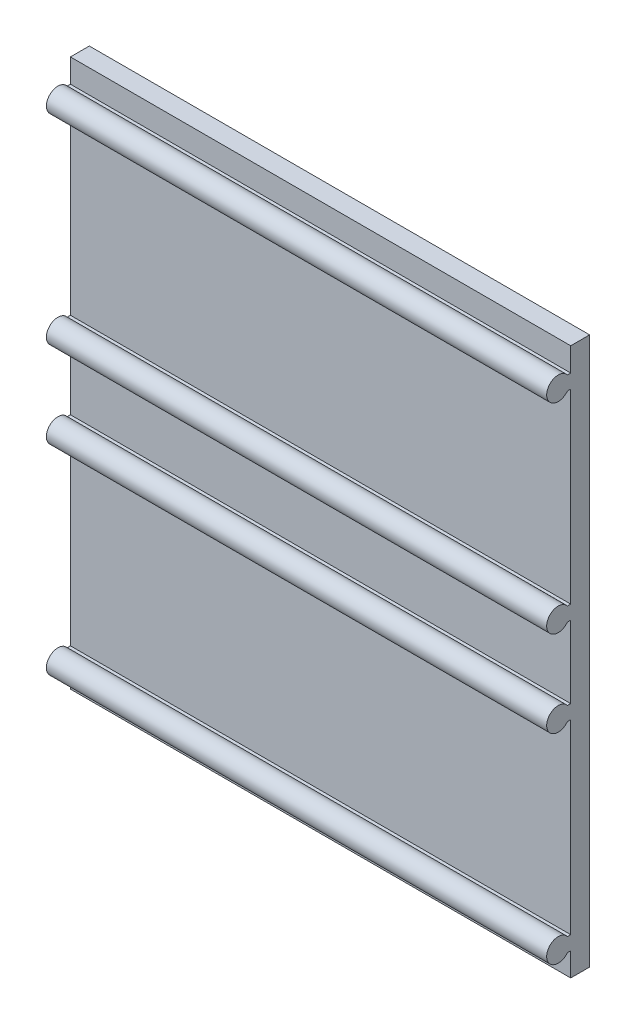
ISO-10303-21;
HEADER;
FILE_DESCRIPTION(('STEP AP214'),'2;1');
FILE_NAME('part.step','',(''),(''),'','','');
FILE_SCHEMA(('AUTOMOTIVE_DESIGN { 1 0 10303 214 1 1 1 1 }'));
ENDSEC;
DATA;
#1=APPLICATION_CONTEXT('core data for automotive mechanical design processes');
#2=APPLICATION_PROTOCOL_DEFINITION('international standard','automotive_design',2000,#1);
#3=PRODUCT_CONTEXT('',#1,'mechanical');
#4=PRODUCT('Part','Part','',(#3));
#5=PRODUCT_RELATED_PRODUCT_CATEGORY('part','',(#4));
#6=PRODUCT_DEFINITION_FORMATION('','',#4);
#7=PRODUCT_DEFINITION_CONTEXT('part definition',#1,'design');
#8=PRODUCT_DEFINITION('design','',#6,#7);
#9=PRODUCT_DEFINITION_SHAPE('','',#8);
#10=(LENGTH_UNIT() NAMED_UNIT(*) SI_UNIT(.MILLI.,.METRE.));
#11=(NAMED_UNIT(*) PLANE_ANGLE_UNIT() SI_UNIT($,.RADIAN.));
#12=(NAMED_UNIT(*) SI_UNIT($,.STERADIAN.) SOLID_ANGLE_UNIT());
#13=UNCERTAINTY_MEASURE_WITH_UNIT(LENGTH_MEASURE(1.E-05),#10,'distance_accuracy_value','');
#14=(GEOMETRIC_REPRESENTATION_CONTEXT(3) GLOBAL_UNCERTAINTY_ASSIGNED_CONTEXT((#13)) GLOBAL_UNIT_ASSIGNED_CONTEXT((#10,
#11,#12)) REPRESENTATION_CONTEXT('',''));
#15=CARTESIAN_POINT('',(0.,0.,0.));
#16=DIRECTION('',(0.,0.,1.));
#17=DIRECTION('',(1.,0.,0.));
#18=AXIS2_PLACEMENT_3D('',#15,#16,#17);
#19=CARTESIAN_POINT('',(90.,224.250000000007,-5.50000000000004));
#20=DIRECTION('',(1.,0.,0.));
#21=DIRECTION('',(0.,0.,-1.));
#22=AXIS2_PLACEMENT_3D('',#19,#20,#21);
#23=PLANE('',#22);
#24=DIRECTION('',(0.,0.,-1.));
#25=VECTOR('',#24,1.);
#26=CARTESIAN_POINT('',(90.,226.500000000007,37.4999999999997));
#27=LINE('',#26,#25);
#28=CARTESIAN_POINT('',(90.,226.500000000007,37.4999999999997));
#29=VERTEX_POINT('',#28);
#30=CARTESIAN_POINT('',(90.,226.500000000007,34.0999999999997));
#31=VERTEX_POINT('',#30);
#32=EDGE_CURVE('E213',#29,#31,#27,.T.);
#33=ORIENTED_EDGE('',*,*,#32,.T.);
#34=DIRECTION('',(0.,-1.,0.));
#35=VECTOR('',#34,1.);
#36=CARTESIAN_POINT('',(90.,325.,34.0999999999997));
#37=LINE('',#36,#35);
#38=CARTESIAN_POINT('',(90.,325.,34.0999999999997));
#39=VERTEX_POINT('',#38);
#40=EDGE_CURVE('E194',#39,#31,#37,.T.);
#41=ORIENTED_EDGE('',*,*,#40,.F.);
#42=DIRECTION('',(0.,0.,1.));
#43=VECTOR('',#42,1.);
#44=CARTESIAN_POINT('',(90.,325.,35.2499999999997));
#45=LINE('',#44,#43);
#46=CARTESIAN_POINT('',(90.,325.,37.4999999999997));
#47=VERTEX_POINT('',#46);
#48=EDGE_CURVE('E199',#39,#47,#45,.T.);
#49=ORIENTED_EDGE('',*,*,#48,.T.);
#50=DIRECTION('',(0.,-1.,0.));
#51=VECTOR('',#50,1.);
#52=CARTESIAN_POINT('',(90.,328.950000000006,37.4999999999878));
#53=LINE('',#52,#51);
#54=CARTESIAN_POINT('',(90.,320.750000000001,37.4999999999875));
#55=VERTEX_POINT('',#54);
#56=EDGE_CURVE('E58',#47,#55,#53,.T.);
#57=ORIENTED_EDGE('',*,*,#56,.T.);
#58=DIRECTION('',(0.,0.,1.));
#59=VECTOR('',#58,1.);
#60=CARTESIAN_POINT('',(90.,320.750000000001,-6.75000000000008));
#61=LINE('',#60,#59);
#62=CARTESIAN_POINT('',(90.,320.750000000001,38.0937617924896));
#63=VERTEX_POINT('',#62);
#64=EDGE_CURVE('E209',#55,#63,#61,.T.);
#65=ORIENTED_EDGE('',*,*,#64,.T.);
#66=CARTESIAN_POINT('',(90.,319.500000000007,39.7499999999997));
#67=DIRECTION('',(1.,0.,0.));
#68=DIRECTION('',(0.,0.,-1.));
#69=AXIS2_PLACEMENT_3D('',#66,#67,#68);
#70=CIRCLE('',#69,2.075);
#71=CARTESIAN_POINT('',(90.,318.250000000001,38.0937617924991));
#72=VERTEX_POINT('',#71);
#73=EDGE_CURVE('E257',#63,#72,#70,.T.);
#74=ORIENTED_EDGE('',*,*,#73,.T.);
#75=DIRECTION('',(0.,0.,-1.));
#76=VECTOR('',#75,1.);
#77=CARTESIAN_POINT('',(90.,318.250000000001,38.0937617924991));
#78=LINE('',#77,#76);
#79=CARTESIAN_POINT('',(90.,318.250000000001,37.4999999999997));
#80=VERTEX_POINT('',#79);
#81=EDGE_CURVE('E260',#72,#80,#78,.T.);
#82=ORIENTED_EDGE('',*,*,#81,.T.);
#83=DIRECTION('',(0.,-1.,0.));
#84=VECTOR('',#83,1.);
#85=CARTESIAN_POINT('',(90.,318.250000000001,37.4999999999997));
#86=LINE('',#85,#84);
#87=CARTESIAN_POINT('',(90.,284.750000000007,37.4999999999997));
#88=VERTEX_POINT('',#87);
#89=EDGE_CURVE('E263',#80,#88,#86,.T.);
#90=ORIENTED_EDGE('',*,*,#89,.T.);
#91=DIRECTION('',(0.,0.,1.));
#92=VECTOR('',#91,1.);
#93=CARTESIAN_POINT('',(90.,284.750000000007,37.4999999999997));
#94=LINE('',#93,#92);
#95=CARTESIAN_POINT('',(90.,284.750000000007,38.0937617924993));
#96=VERTEX_POINT('',#95);
#97=EDGE_CURVE('E266',#88,#96,#94,.T.);
#98=ORIENTED_EDGE('',*,*,#97,.T.);
#99=CARTESIAN_POINT('',(90.,283.500000000001,39.7499999999994));
#100=DIRECTION('',(1.,0.,0.));
#101=DIRECTION('',(0.,0.,-1.));
#102=AXIS2_PLACEMENT_3D('',#99,#100,#101);
#103=CIRCLE('',#102,2.07499999999945);
#104=CARTESIAN_POINT('',(90.,282.250000000007,38.0937617924901));
#105=VERTEX_POINT('',#104);
#106=EDGE_CURVE('E269',#96,#105,#103,.T.);
#107=ORIENTED_EDGE('',*,*,#106,.T.);
#108=DIRECTION('',(0.,5.60943650467305E-13,-1.));
#109=VECTOR('',#108,1.);
#110=CARTESIAN_POINT('',(90.,282.250000000007,38.0937617924901));
#111=LINE('',#110,#109);
#112=CARTESIAN_POINT('',(90.,282.250000000008,37.4999999999997));
#113=VERTEX_POINT('',#112);
#114=EDGE_CURVE('E272',#105,#113,#111,.T.);
#115=ORIENTED_EDGE('',*,*,#114,.T.);
#116=DIRECTION('',(0.,-1.,0.));
#117=VECTOR('',#116,1.);
#118=CARTESIAN_POINT('',(90.,282.250000000008,37.4999999999997));
#119=LINE('',#118,#117);
#120=CARTESIAN_POINT('',(90.,269.25,37.4999999999997));
#121=VERTEX_POINT('',#120);
#122=EDGE_CURVE('E275',#113,#121,#119,.T.);
#123=ORIENTED_EDGE('',*,*,#122,.T.);
#124=DIRECTION('',(0.,1.21537790934668E-12,1.));
#125=VECTOR('',#124,1.);
#126=CARTESIAN_POINT('',(90.,269.25,37.4999999999997));
#127=LINE('',#126,#125);
#128=CARTESIAN_POINT('',(90.,269.250000000001,38.0937617924896));
#129=VERTEX_POINT('',#128);
#130=EDGE_CURVE('E278',#121,#129,#127,.T.);
#131=ORIENTED_EDGE('',*,*,#130,.T.);
#132=CARTESIAN_POINT('',(90.,268.000000000007,39.7499999999997));
#133=DIRECTION('',(1.,0.,0.));
#134=DIRECTION('',(0.,0.,-1.));
#135=AXIS2_PLACEMENT_3D('',#132,#133,#134);
#136=CIRCLE('',#135,2.075);
#137=CARTESIAN_POINT('',(90.,266.750000000001,38.0937617924991));
#138=VERTEX_POINT('',#137);
#139=EDGE_CURVE('E281',#129,#138,#136,.T.);
#140=ORIENTED_EDGE('',*,*,#139,.T.);
#141=DIRECTION('',(0.,0.,-1.));
#142=VECTOR('',#141,1.);
#143=CARTESIAN_POINT('',(90.,266.750000000001,38.0937617924991));
#144=LINE('',#143,#142);
#145=CARTESIAN_POINT('',(90.,266.750000000001,37.4999999999997));
#146=VERTEX_POINT('',#145);
#147=EDGE_CURVE('E284',#138,#146,#144,.T.);
#148=ORIENTED_EDGE('',*,*,#147,.T.);
#149=DIRECTION('',(0.,-1.,0.));
#150=VECTOR('',#149,1.);
#151=CARTESIAN_POINT('',(90.,266.750000000001,37.4999999999997));
#152=LINE('',#151,#150);
#153=CARTESIAN_POINT('',(90.,233.250000000007,37.4999999999997));
#154=VERTEX_POINT('',#153);
#155=EDGE_CURVE('E287',#146,#154,#152,.T.);
#156=ORIENTED_EDGE('',*,*,#155,.T.);
#157=DIRECTION('',(0.,0.,1.));
#158=VECTOR('',#157,1.);
#159=CARTESIAN_POINT('',(90.,233.250000000007,37.4999999999997));
#160=LINE('',#159,#158);
#161=CARTESIAN_POINT('',(90.,233.250000000007,38.0937617924993));
#162=VERTEX_POINT('',#161);
#163=EDGE_CURVE('E290',#154,#162,#160,.T.);
#164=ORIENTED_EDGE('',*,*,#163,.T.);
#165=CARTESIAN_POINT('',(90.,232.000000000001,39.7499999999994));
#166=DIRECTION('',(1.,0.,0.));
#167=DIRECTION('',(0.,0.,-1.));
#168=AXIS2_PLACEMENT_3D('',#165,#166,#167);
#169=CIRCLE('',#168,2.07499999999947);
#170=CARTESIAN_POINT('',(90.,230.750000000007,38.0937617924903));
#171=VERTEX_POINT('',#170);
#172=EDGE_CURVE('E293',#162,#171,#169,.T.);
#173=ORIENTED_EDGE('',*,*,#172,.T.);
#174=DIRECTION('',(0.,0.,-1.));
#175=VECTOR('',#174,1.);
#176=CARTESIAN_POINT('',(90.,230.750000000007,38.0937617924903));
#177=LINE('',#176,#175);
#178=CARTESIAN_POINT('',(90.,230.750000000007,37.4999999999997));
#179=VERTEX_POINT('',#178);
#180=EDGE_CURVE('E296',#171,#179,#177,.T.);
#181=ORIENTED_EDGE('',*,*,#180,.T.);
#182=DIRECTION('',(0.,-1.,0.));
#183=VECTOR('',#182,1.);
#184=CARTESIAN_POINT('',(90.,230.750000000007,37.4999999999997));
#185=LINE('',#184,#183);
#186=EDGE_CURVE('E299',#179,#29,#185,.T.);
#187=ORIENTED_EDGE('',*,*,#186,.T.);
#188=EDGE_LOOP('',(#33,#41,#49,#57,#65,#74,#82,#90,#98,#107,#115,#123,#131,#140,#148,#156,#164,
#173,#181,#187));
#189=FACE_BOUND('',#188,.T.);
#190=ADVANCED_FACE('F33',(#189),#23,.T.);
#191=CARTESIAN_POINT('',(0.,224.250000000007,-5.50000000000004));
#192=DIRECTION('',(1.,0.,0.));
#193=DIRECTION('',(0.,0.,-1.));
#194=AXIS2_PLACEMENT_3D('',#191,#192,#193);
#195=PLANE('',#194);
#196=DIRECTION('',(0.,0.,1.));
#197=VECTOR('',#196,1.);
#198=CARTESIAN_POINT('',(0.,325.,35.2499999999997));
#199=LINE('',#198,#197);
#200=CARTESIAN_POINT('',(0.,325.,34.0999999999997));
#201=VERTEX_POINT('',#200);
#202=CARTESIAN_POINT('',(0.,325.,37.4999999999876));
#203=VERTEX_POINT('',#202);
#204=EDGE_CURVE('E50',#201,#203,#199,.T.);
#205=ORIENTED_EDGE('',*,*,#204,.F.);
#206=DIRECTION('',(0.,1.,0.));
#207=VECTOR('',#206,1.);
#208=CARTESIAN_POINT('',(0.,226.500000000007,34.0999999999997));
#209=LINE('',#208,#207);
#210=CARTESIAN_POINT('',(0.,226.500000000007,34.0999999999997));
#211=VERTEX_POINT('',#210);
#212=EDGE_CURVE('E184',#211,#201,#209,.T.);
#213=ORIENTED_EDGE('',*,*,#212,.F.);
#214=DIRECTION('',(0.,0.,-1.));
#215=VECTOR('',#214,1.);
#216=CARTESIAN_POINT('',(0.,226.500000000007,37.4999999999997));
#217=LINE('',#216,#215);
#218=CARTESIAN_POINT('',(0.,226.500000000007,37.4999999999997));
#219=VERTEX_POINT('',#218);
#220=EDGE_CURVE('E172',#219,#211,#217,.T.);
#221=ORIENTED_EDGE('',*,*,#220,.F.);
#222=DIRECTION('',(0.,-1.,0.));
#223=VECTOR('',#222,1.);
#224=CARTESIAN_POINT('',(0.,230.750000000007,37.4999999999997));
#225=LINE('',#224,#223);
#226=CARTESIAN_POINT('',(0.,230.750000000007,37.4999999999997));
#227=VERTEX_POINT('',#226);
#228=EDGE_CURVE('E181',#227,#219,#225,.T.);
#229=ORIENTED_EDGE('',*,*,#228,.F.);
#230=DIRECTION('',(0.,0.,-1.));
#231=VECTOR('',#230,1.);
#232=CARTESIAN_POINT('',(0.,230.750000000007,38.0937617924903));
#233=LINE('',#232,#231);
#234=CARTESIAN_POINT('',(0.,230.750000000007,38.0937617924903));
#235=VERTEX_POINT('',#234);
#236=EDGE_CURVE('E252',#235,#227,#233,.T.);
#237=ORIENTED_EDGE('',*,*,#236,.F.);
#238=CARTESIAN_POINT('',(0.,232.000000000001,39.7499999999994));
#239=DIRECTION('',(1.,0.,0.));
#240=DIRECTION('',(0.,0.,-1.));
#241=AXIS2_PLACEMENT_3D('',#238,#239,#240);
#242=CIRCLE('',#241,2.07499999999947);
#243=CARTESIAN_POINT('',(0.,233.250000000007,38.0937617924993));
#244=VERTEX_POINT('',#243);
#245=EDGE_CURVE('E249',#244,#235,#242,.T.);
#246=ORIENTED_EDGE('',*,*,#245,.F.);
#247=DIRECTION('',(0.,0.,1.));
#248=VECTOR('',#247,1.);
#249=CARTESIAN_POINT('',(0.,233.250000000007,37.4999999999997));
#250=LINE('',#249,#248);
#251=CARTESIAN_POINT('',(0.,233.250000000007,37.4999999999997));
#252=VERTEX_POINT('',#251);
#253=EDGE_CURVE('E246',#252,#244,#250,.T.);
#254=ORIENTED_EDGE('',*,*,#253,.F.);
#255=DIRECTION('',(0.,-1.,0.));
#256=VECTOR('',#255,1.);
#257=CARTESIAN_POINT('',(0.,266.750000000001,37.4999999999997));
#258=LINE('',#257,#256);
#259=CARTESIAN_POINT('',(0.,266.750000000001,37.4999999999997));
#260=VERTEX_POINT('',#259);
#261=EDGE_CURVE('E243',#260,#252,#258,.T.);
#262=ORIENTED_EDGE('',*,*,#261,.F.);
#263=DIRECTION('',(0.,0.,-1.));
#264=VECTOR('',#263,1.);
#265=CARTESIAN_POINT('',(0.,266.750000000001,38.0937617924991));
#266=LINE('',#265,#264);
#267=CARTESIAN_POINT('',(0.,266.750000000001,38.0937617924991));
#268=VERTEX_POINT('',#267);
#269=EDGE_CURVE('E240',#268,#260,#266,.T.);
#270=ORIENTED_EDGE('',*,*,#269,.F.);
#271=CARTESIAN_POINT('',(0.,268.000000000007,39.7499999999997));
#272=DIRECTION('',(1.,0.,0.));
#273=DIRECTION('',(0.,0.,-1.));
#274=AXIS2_PLACEMENT_3D('',#271,#272,#273);
#275=CIRCLE('',#274,2.075);
#276=CARTESIAN_POINT('',(0.,269.250000000001,38.0937617924896));
#277=VERTEX_POINT('',#276);
#278=EDGE_CURVE('E237',#277,#268,#275,.T.);
#279=ORIENTED_EDGE('',*,*,#278,.F.);
#280=DIRECTION('',(0.,1.21537790934668E-12,1.));
#281=VECTOR('',#280,1.);
#282=CARTESIAN_POINT('',(0.,269.25,37.4999999999997));
#283=LINE('',#282,#281);
#284=CARTESIAN_POINT('',(0.,269.25,37.4999999999997));
#285=VERTEX_POINT('',#284);
#286=EDGE_CURVE('E234',#285,#277,#283,.T.);
#287=ORIENTED_EDGE('',*,*,#286,.F.);
#288=DIRECTION('',(0.,-1.,0.));
#289=VECTOR('',#288,1.);
#290=CARTESIAN_POINT('',(0.,282.250000000008,37.4999999999997));
#291=LINE('',#290,#289);
#292=CARTESIAN_POINT('',(0.,282.250000000008,37.4999999999997));
#293=VERTEX_POINT('',#292);
#294=EDGE_CURVE('E231',#293,#285,#291,.T.);
#295=ORIENTED_EDGE('',*,*,#294,.F.);
#296=DIRECTION('',(0.,5.60943650467305E-13,-1.));
#297=VECTOR('',#296,1.);
#298=CARTESIAN_POINT('',(0.,282.250000000007,38.0937617924901));
#299=LINE('',#298,#297);
#300=CARTESIAN_POINT('',(0.,282.250000000007,38.0937617924901));
#301=VERTEX_POINT('',#300);
#302=EDGE_CURVE('E228',#301,#293,#299,.T.);
#303=ORIENTED_EDGE('',*,*,#302,.F.);
#304=CARTESIAN_POINT('',(0.,283.500000000001,39.7499999999994));
#305=DIRECTION('',(1.,0.,0.));
#306=DIRECTION('',(0.,0.,-1.));
#307=AXIS2_PLACEMENT_3D('',#304,#305,#306);
#308=CIRCLE('',#307,2.07499999999945);
#309=CARTESIAN_POINT('',(0.,284.750000000007,38.0937617924993));
#310=VERTEX_POINT('',#309);
#311=EDGE_CURVE('E225',#310,#301,#308,.T.);
#312=ORIENTED_EDGE('',*,*,#311,.F.);
#313=DIRECTION('',(0.,0.,1.));
#314=VECTOR('',#313,1.);
#315=CARTESIAN_POINT('',(0.,284.750000000007,37.4999999999997));
#316=LINE('',#315,#314);
#317=CARTESIAN_POINT('',(0.,284.750000000007,37.4999999999997));
#318=VERTEX_POINT('',#317);
#319=EDGE_CURVE('E222',#318,#310,#316,.T.);
#320=ORIENTED_EDGE('',*,*,#319,.F.);
#321=DIRECTION('',(0.,-1.,0.));
#322=VECTOR('',#321,1.);
#323=CARTESIAN_POINT('',(0.,318.250000000001,37.4999999999997));
#324=LINE('',#323,#322);
#325=CARTESIAN_POINT('',(0.,318.250000000001,37.4999999999997));
#326=VERTEX_POINT('',#325);
#327=EDGE_CURVE('E219',#326,#318,#324,.T.);
#328=ORIENTED_EDGE('',*,*,#327,.F.);
#329=DIRECTION('',(0.,0.,-1.));
#330=VECTOR('',#329,1.);
#331=CARTESIAN_POINT('',(0.,318.250000000001,38.0937617924991));
#332=LINE('',#331,#330);
#333=CARTESIAN_POINT('',(0.,318.250000000001,38.0937617924991));
#334=VERTEX_POINT('',#333);
#335=EDGE_CURVE('E216',#334,#326,#332,.T.);
#336=ORIENTED_EDGE('',*,*,#335,.F.);
#337=CARTESIAN_POINT('',(0.,319.500000000007,39.7499999999997));
#338=DIRECTION('',(1.,0.,0.));
#339=DIRECTION('',(0.,0.,-1.));
#340=AXIS2_PLACEMENT_3D('',#337,#338,#339);
#341=CIRCLE('',#340,2.075);
#342=CARTESIAN_POINT('',(0.,320.750000000001,38.0937617924896));
#343=VERTEX_POINT('',#342);
#344=EDGE_CURVE('E212',#343,#334,#341,.T.);
#345=ORIENTED_EDGE('',*,*,#344,.F.);
#346=DIRECTION('',(0.,0.,1.));
#347=VECTOR('',#346,1.);
#348=CARTESIAN_POINT('',(0.,320.750000000001,-6.75000000000008));
#349=LINE('',#348,#347);
#350=CARTESIAN_POINT('',(0.,320.749999999999,37.4999999999875));
#351=VERTEX_POINT('',#350);
#352=EDGE_CURVE('E210',#351,#343,#349,.T.);
#353=ORIENTED_EDGE('',*,*,#352,.F.);
#354=DIRECTION('',(0.,-1.,0.));
#355=VECTOR('',#354,1.);
#356=CARTESIAN_POINT('',(0.,328.950000000006,37.4999999999878));
#357=LINE('',#356,#355);
#358=EDGE_CURVE('E207',#203,#351,#357,.T.);
#359=ORIENTED_EDGE('',*,*,#358,.F.);
#360=EDGE_LOOP('',(#205,#213,#221,#229,#237,#246,#254,#262,#270,#279,#287,#295,#303,#312,#320,
#328,#336,#345,#353,#359));
#361=FACE_BOUND('',#360,.T.);
#362=ADVANCED_FACE('F185',(#361),#195,.F.);
#363=CARTESIAN_POINT('',(0.,320.750000000001,-6.75000000000008));
#364=DIRECTION('',(0.,1.,0.));
#365=DIRECTION('',(0.,0.,1.));
#366=AXIS2_PLACEMENT_3D('',#363,#364,#365);
#367=PLANE('',#366);
#368=ORIENTED_EDGE('',*,*,#64,.F.);
#369=DIRECTION('',(1.,0.,0.));
#370=VECTOR('',#369,1.);
#371=CARTESIAN_POINT('',(90.,320.749999999999,37.4999999999875));
#372=LINE('',#371,#370);
#373=EDGE_CURVE('E204',#351,#55,#372,.T.);
#374=ORIENTED_EDGE('',*,*,#373,.F.);
#375=ORIENTED_EDGE('',*,*,#352,.T.);
#376=DIRECTION('',(1.,0.,0.));
#377=VECTOR('',#376,1.);
#378=CARTESIAN_POINT('',(0.,320.750000000001,38.0937617924896));
#379=LINE('',#378,#377);
#380=EDGE_CURVE('E37',#343,#63,#379,.T.);
#381=ORIENTED_EDGE('',*,*,#380,.T.);
#382=EDGE_LOOP('',(#368,#374,#375,#381));
#383=FACE_BOUND('',#382,.T.);
#384=ADVANCED_FACE('F35',(#383),#367,.T.);
#385=CARTESIAN_POINT('',(0.,226.500000000007,37.4999999999997));
#386=DIRECTION('',(0.,-1.,0.));
#387=DIRECTION('',(0.,0.,-1.));
#388=AXIS2_PLACEMENT_3D('',#385,#386,#387);
#389=PLANE('',#388);
#390=ORIENTED_EDGE('',*,*,#220,.T.);
#391=DIRECTION('',(-1.,0.,0.));
#392=VECTOR('',#391,1.);
#393=CARTESIAN_POINT('',(90.,226.500000000007,34.0999999999997));
#394=LINE('',#393,#392);
#395=EDGE_CURVE('E177',#31,#211,#394,.T.);
#396=ORIENTED_EDGE('',*,*,#395,.F.);
#397=ORIENTED_EDGE('',*,*,#32,.F.);
#398=DIRECTION('',(1.,0.,0.));
#399=VECTOR('',#398,1.);
#400=CARTESIAN_POINT('',(0.,226.500000000007,37.4999999999997));
#401=LINE('',#400,#399);
#402=EDGE_CURVE('E11',#219,#29,#401,.T.);
#403=ORIENTED_EDGE('',*,*,#402,.F.);
#404=EDGE_LOOP('',(#390,#396,#397,#403));
#405=FACE_BOUND('',#404,.T.);
#406=ADVANCED_FACE('F174',(#405),#389,.T.);
#407=CARTESIAN_POINT('',(0.,230.750000000007,37.4999999999997));
#408=DIRECTION('',(0.,0.,1.));
#409=DIRECTION('',(1.,0.,0.));
#410=AXIS2_PLACEMENT_3D('',#407,#408,#409);
#411=PLANE('',#410);
#412=ORIENTED_EDGE('',*,*,#186,.F.);
#413=DIRECTION('',(1.,0.,0.));
#414=VECTOR('',#413,1.);
#415=CARTESIAN_POINT('',(0.,230.750000000007,37.4999999999997));
#416=LINE('',#415,#414);
#417=EDGE_CURVE('E42',#227,#179,#416,.T.);
#418=ORIENTED_EDGE('',*,*,#417,.F.);
#419=ORIENTED_EDGE('',*,*,#228,.T.);
#420=ORIENTED_EDGE('',*,*,#402,.T.);
#421=EDGE_LOOP('',(#412,#418,#419,#420));
#422=FACE_BOUND('',#421,.T.);
#423=ADVANCED_FACE('F392',(#422),#411,.T.);
#424=CARTESIAN_POINT('',(0.,230.750000000007,38.0937617924903));
#425=DIRECTION('',(0.,-1.,0.));
#426=DIRECTION('',(0.,0.,-1.));
#427=AXIS2_PLACEMENT_3D('',#424,#425,#426);
#428=PLANE('',#427);
#429=ORIENTED_EDGE('',*,*,#180,.F.);
#430=DIRECTION('',(1.,0.,0.));
#431=VECTOR('',#430,1.);
#432=CARTESIAN_POINT('',(0.,230.750000000007,38.0937617924903));
#433=LINE('',#432,#431);
#434=EDGE_CURVE('E304',#235,#171,#433,.T.);
#435=ORIENTED_EDGE('',*,*,#434,.F.);
#436=ORIENTED_EDGE('',*,*,#236,.T.);
#437=ORIENTED_EDGE('',*,*,#417,.T.);
#438=EDGE_LOOP('',(#429,#435,#436,#437));
#439=FACE_BOUND('',#438,.T.);
#440=ADVANCED_FACE('F389',(#439),#428,.T.);
#441=CARTESIAN_POINT('',(0.,232.000000000001,39.7499999999994));
#442=DIRECTION('',(1.,0.,0.));
#443=DIRECTION('',(0.,0.,-1.));
#444=AXIS2_PLACEMENT_3D('',#441,#442,#443);
#445=CYLINDRICAL_SURFACE('',#444,2.07499999999947);
#446=ORIENTED_EDGE('',*,*,#172,.F.);
#447=DIRECTION('',(1.,0.,0.));
#448=VECTOR('',#447,1.);
#449=CARTESIAN_POINT('',(0.,233.250000000007,38.0937617924993));
#450=LINE('',#449,#448);
#451=EDGE_CURVE('E306',#244,#162,#450,.T.);
#452=ORIENTED_EDGE('',*,*,#451,.F.);
#453=ORIENTED_EDGE('',*,*,#245,.T.);
#454=ORIENTED_EDGE('',*,*,#434,.T.);
#455=EDGE_LOOP('',(#446,#452,#453,#454));
#456=FACE_BOUND('',#455,.T.);
#457=ADVANCED_FACE('F385',(#456),#445,.T.);
#458=CARTESIAN_POINT('',(0.,233.250000000007,37.4999999999997));
#459=DIRECTION('',(0.,1.,0.));
#460=DIRECTION('',(0.,0.,1.));
#461=AXIS2_PLACEMENT_3D('',#458,#459,#460);
#462=PLANE('',#461);
#463=ORIENTED_EDGE('',*,*,#163,.F.);
#464=DIRECTION('',(1.,0.,0.));
#465=VECTOR('',#464,1.);
#466=CARTESIAN_POINT('',(0.,233.250000000007,37.4999999999997));
#467=LINE('',#466,#465);
#468=EDGE_CURVE('E308',#252,#154,#467,.T.);
#469=ORIENTED_EDGE('',*,*,#468,.F.);
#470=ORIENTED_EDGE('',*,*,#253,.T.);
#471=ORIENTED_EDGE('',*,*,#451,.T.);
#472=EDGE_LOOP('',(#463,#469,#470,#471));
#473=FACE_BOUND('',#472,.T.);
#474=ADVANCED_FACE('F381',(#473),#462,.T.);
#475=CARTESIAN_POINT('',(0.,266.750000000001,37.4999999999997));
#476=DIRECTION('',(0.,0.,1.));
#477=DIRECTION('',(0.,-1.,0.));
#478=AXIS2_PLACEMENT_3D('',#475,#476,#477);
#479=PLANE('',#478);
#480=ORIENTED_EDGE('',*,*,#155,.F.);
#481=DIRECTION('',(1.,0.,0.));
#482=VECTOR('',#481,1.);
#483=CARTESIAN_POINT('',(0.,266.750000000001,37.4999999999997));
#484=LINE('',#483,#482);
#485=EDGE_CURVE('E310',#260,#146,#484,.T.);
#486=ORIENTED_EDGE('',*,*,#485,.F.);
#487=ORIENTED_EDGE('',*,*,#261,.T.);
#488=ORIENTED_EDGE('',*,*,#468,.T.);
#489=EDGE_LOOP('',(#480,#486,#487,#488));
#490=FACE_BOUND('',#489,.T.);
#491=ADVANCED_FACE('F377',(#490),#479,.T.);
#492=CARTESIAN_POINT('',(0.,266.750000000001,38.0937617924991));
#493=DIRECTION('',(0.,-1.,0.));
#494=DIRECTION('',(0.,0.,-1.));
#495=AXIS2_PLACEMENT_3D('',#492,#493,#494);
#496=PLANE('',#495);
#497=ORIENTED_EDGE('',*,*,#147,.F.);
#498=DIRECTION('',(1.,0.,0.));
#499=VECTOR('',#498,1.);
#500=CARTESIAN_POINT('',(0.,266.750000000001,38.0937617924991));
#501=LINE('',#500,#499);
#502=EDGE_CURVE('E312',#268,#138,#501,.T.);
#503=ORIENTED_EDGE('',*,*,#502,.F.);
#504=ORIENTED_EDGE('',*,*,#269,.T.);
#505=ORIENTED_EDGE('',*,*,#485,.T.);
#506=EDGE_LOOP('',(#497,#503,#504,#505));
#507=FACE_BOUND('',#506,.T.);
#508=ADVANCED_FACE('F373',(#507),#496,.T.);
#509=CARTESIAN_POINT('',(0.,268.000000000007,39.7499999999997));
#510=DIRECTION('',(1.,0.,0.));
#511=DIRECTION('',(0.,0.,-1.));
#512=AXIS2_PLACEMENT_3D('',#509,#510,#511);
#513=CYLINDRICAL_SURFACE('',#512,2.075);
#514=ORIENTED_EDGE('',*,*,#139,.F.);
#515=DIRECTION('',(1.,0.,0.));
#516=VECTOR('',#515,1.);
#517=CARTESIAN_POINT('',(0.,269.250000000001,38.0937617924896));
#518=LINE('',#517,#516);
#519=EDGE_CURVE('E314',#277,#129,#518,.T.);
#520=ORIENTED_EDGE('',*,*,#519,.F.);
#521=ORIENTED_EDGE('',*,*,#278,.T.);
#522=ORIENTED_EDGE('',*,*,#502,.T.);
#523=EDGE_LOOP('',(#514,#520,#521,#522));
#524=FACE_BOUND('',#523,.T.);
#525=ADVANCED_FACE('F369',(#524),#513,.T.);
#526=CARTESIAN_POINT('',(0.,269.25,37.4999999999997));
#527=DIRECTION('',(0.,1.,-1.21537790934668E-12));
#528=DIRECTION('',(0.,1.21537790934668E-12,1.));
#529=AXIS2_PLACEMENT_3D('',#526,#527,#528);
#530=PLANE('',#529);
#531=ORIENTED_EDGE('',*,*,#130,.F.);
#532=DIRECTION('',(1.,0.,0.));
#533=VECTOR('',#532,1.);
#534=CARTESIAN_POINT('',(0.,269.25,37.4999999999997));
#535=LINE('',#534,#533);
#536=EDGE_CURVE('E316',#285,#121,#535,.T.);
#537=ORIENTED_EDGE('',*,*,#536,.F.);
#538=ORIENTED_EDGE('',*,*,#286,.T.);
#539=ORIENTED_EDGE('',*,*,#519,.T.);
#540=EDGE_LOOP('',(#531,#537,#538,#539));
#541=FACE_BOUND('',#540,.T.);
#542=ADVANCED_FACE('F365',(#541),#530,.T.);
#543=CARTESIAN_POINT('',(0.,282.250000000008,37.4999999999997));
#544=DIRECTION('',(0.,0.,1.));
#545=DIRECTION('',(0.,-1.,0.));
#546=AXIS2_PLACEMENT_3D('',#543,#544,#545);
#547=PLANE('',#546);
#548=ORIENTED_EDGE('',*,*,#122,.F.);
#549=DIRECTION('',(1.,0.,0.));
#550=VECTOR('',#549,1.);
#551=CARTESIAN_POINT('',(0.,282.250000000008,37.4999999999997));
#552=LINE('',#551,#550);
#553=EDGE_CURVE('E318',#293,#113,#552,.T.);
#554=ORIENTED_EDGE('',*,*,#553,.F.);
#555=ORIENTED_EDGE('',*,*,#294,.T.);
#556=ORIENTED_EDGE('',*,*,#536,.T.);
#557=EDGE_LOOP('',(#548,#554,#555,#556));
#558=FACE_BOUND('',#557,.T.);
#559=ADVANCED_FACE('F361',(#558),#547,.T.);
#560=CARTESIAN_POINT('',(0.,282.250000000007,38.0937617924901));
#561=DIRECTION('',(0.,-1.,-5.60943650467305E-13));
#562=DIRECTION('',(0.,5.60943650467305E-13,-1.));
#563=AXIS2_PLACEMENT_3D('',#560,#561,#562);
#564=PLANE('',#563);
#565=ORIENTED_EDGE('',*,*,#114,.F.);
#566=DIRECTION('',(1.,0.,0.));
#567=VECTOR('',#566,1.);
#568=CARTESIAN_POINT('',(0.,282.250000000007,38.0937617924901));
#569=LINE('',#568,#567);
#570=EDGE_CURVE('E320',#301,#105,#569,.T.);
#571=ORIENTED_EDGE('',*,*,#570,.F.);
#572=ORIENTED_EDGE('',*,*,#302,.T.);
#573=ORIENTED_EDGE('',*,*,#553,.T.);
#574=EDGE_LOOP('',(#565,#571,#572,#573));
#575=FACE_BOUND('',#574,.T.);
#576=ADVANCED_FACE('F357',(#575),#564,.T.);
#577=CARTESIAN_POINT('',(0.,283.500000000001,39.7499999999994));
#578=DIRECTION('',(1.,0.,0.));
#579=DIRECTION('',(0.,0.,-1.));
#580=AXIS2_PLACEMENT_3D('',#577,#578,#579);
#581=CYLINDRICAL_SURFACE('',#580,2.07499999999945);
#582=ORIENTED_EDGE('',*,*,#106,.F.);
#583=DIRECTION('',(1.,0.,0.));
#584=VECTOR('',#583,1.);
#585=CARTESIAN_POINT('',(0.,284.750000000007,38.0937617924993));
#586=LINE('',#585,#584);
#587=EDGE_CURVE('E322',#310,#96,#586,.T.);
#588=ORIENTED_EDGE('',*,*,#587,.F.);
#589=ORIENTED_EDGE('',*,*,#311,.T.);
#590=ORIENTED_EDGE('',*,*,#570,.T.);
#591=EDGE_LOOP('',(#582,#588,#589,#590));
#592=FACE_BOUND('',#591,.T.);
#593=ADVANCED_FACE('F353',(#592),#581,.T.);
#594=CARTESIAN_POINT('',(0.,284.750000000007,37.4999999999997));
#595=DIRECTION('',(0.,1.,0.));
#596=DIRECTION('',(0.,0.,1.));
#597=AXIS2_PLACEMENT_3D('',#594,#595,#596);
#598=PLANE('',#597);
#599=ORIENTED_EDGE('',*,*,#97,.F.);
#600=DIRECTION('',(1.,0.,0.));
#601=VECTOR('',#600,1.);
#602=CARTESIAN_POINT('',(0.,284.750000000007,37.4999999999997));
#603=LINE('',#602,#601);
#604=EDGE_CURVE('E324',#318,#88,#603,.T.);
#605=ORIENTED_EDGE('',*,*,#604,.F.);
#606=ORIENTED_EDGE('',*,*,#319,.T.);
#607=ORIENTED_EDGE('',*,*,#587,.T.);
#608=EDGE_LOOP('',(#599,#605,#606,#607));
#609=FACE_BOUND('',#608,.T.);
#610=ADVANCED_FACE('F349',(#609),#598,.T.);
#611=CARTESIAN_POINT('',(0.,318.250000000001,37.4999999999997));
#612=DIRECTION('',(0.,0.,1.));
#613=DIRECTION('',(0.,-1.,0.));
#614=AXIS2_PLACEMENT_3D('',#611,#612,#613);
#615=PLANE('',#614);
#616=ORIENTED_EDGE('',*,*,#89,.F.);
#617=DIRECTION('',(1.,0.,0.));
#618=VECTOR('',#617,1.);
#619=CARTESIAN_POINT('',(0.,318.250000000001,37.4999999999997));
#620=LINE('',#619,#618);
#621=EDGE_CURVE('E326',#326,#80,#620,.T.);
#622=ORIENTED_EDGE('',*,*,#621,.F.);
#623=ORIENTED_EDGE('',*,*,#327,.T.);
#624=ORIENTED_EDGE('',*,*,#604,.T.);
#625=EDGE_LOOP('',(#616,#622,#623,#624));
#626=FACE_BOUND('',#625,.T.);
#627=ADVANCED_FACE('F345',(#626),#615,.T.);
#628=CARTESIAN_POINT('',(0.,318.250000000001,38.0937617924991));
#629=DIRECTION('',(0.,-1.,0.));
#630=DIRECTION('',(0.,0.,-1.));
#631=AXIS2_PLACEMENT_3D('',#628,#629,#630);
#632=PLANE('',#631);
#633=ORIENTED_EDGE('',*,*,#81,.F.);
#634=DIRECTION('',(1.,0.,0.));
#635=VECTOR('',#634,1.);
#636=CARTESIAN_POINT('',(0.,318.250000000001,38.0937617924991));
#637=LINE('',#636,#635);
#638=EDGE_CURVE('E327',#334,#72,#637,.T.);
#639=ORIENTED_EDGE('',*,*,#638,.F.);
#640=ORIENTED_EDGE('',*,*,#335,.T.);
#641=ORIENTED_EDGE('',*,*,#621,.T.);
#642=EDGE_LOOP('',(#633,#639,#640,#641));
#643=FACE_BOUND('',#642,.T.);
#644=ADVANCED_FACE('F341',(#643),#632,.T.);
#645=CARTESIAN_POINT('',(0.,319.500000000007,39.7499999999997));
#646=DIRECTION('',(1.,0.,0.));
#647=DIRECTION('',(0.,0.,-1.));
#648=AXIS2_PLACEMENT_3D('',#645,#646,#647);
#649=CYLINDRICAL_SURFACE('',#648,2.075);
#650=ORIENTED_EDGE('',*,*,#73,.F.);
#651=ORIENTED_EDGE('',*,*,#380,.F.);
#652=ORIENTED_EDGE('',*,*,#344,.T.);
#653=ORIENTED_EDGE('',*,*,#638,.T.);
#654=EDGE_LOOP('',(#650,#651,#652,#653));
#655=FACE_BOUND('',#654,.T.);
#656=ADVANCED_FACE('F338',(#655),#649,.T.);
#657=CARTESIAN_POINT('',(90.,328.950000000006,37.4999999999878));
#658=DIRECTION('',(0.,0.,-1.));
#659=DIRECTION('',(0.,1.,0.));
#660=AXIS2_PLACEMENT_3D('',#657,#658,#659);
#661=PLANE('',#660);
#662=ORIENTED_EDGE('',*,*,#56,.F.);
#663=DIRECTION('',(-1.,0.,0.));
#664=VECTOR('',#663,1.);
#665=CARTESIAN_POINT('',(90.,325.,37.4999999999997));
#666=LINE('',#665,#664);
#667=EDGE_CURVE('E201',#47,#203,#666,.T.);
#668=ORIENTED_EDGE('',*,*,#667,.T.);
#669=ORIENTED_EDGE('',*,*,#358,.T.);
#670=ORIENTED_EDGE('',*,*,#373,.T.);
#671=EDGE_LOOP('',(#662,#668,#669,#670));
#672=FACE_BOUND('',#671,.T.);
#673=ADVANCED_FACE('F395',(#672),#661,.F.);
#674=CARTESIAN_POINT('',(90.,325.,35.2499999999997));
#675=DIRECTION('',(0.,-1.,0.));
#676=DIRECTION('',(0.,0.,-1.));
#677=AXIS2_PLACEMENT_3D('',#674,#675,#676);
#678=PLANE('',#677);
#679=ORIENTED_EDGE('',*,*,#48,.F.);
#680=DIRECTION('',(1.,0.,0.));
#681=VECTOR('',#680,1.);
#682=CARTESIAN_POINT('',(0.,325.,34.0999999999997));
#683=LINE('',#682,#681);
#684=EDGE_CURVE('E189',#201,#39,#683,.T.);
#685=ORIENTED_EDGE('',*,*,#684,.F.);
#686=ORIENTED_EDGE('',*,*,#204,.T.);
#687=ORIENTED_EDGE('',*,*,#667,.F.);
#688=EDGE_LOOP('',(#679,#685,#686,#687));
#689=FACE_BOUND('',#688,.T.);
#690=ADVANCED_FACE('F393',(#689),#678,.F.);
#691=CARTESIAN_POINT('',(0.,0.,34.0999999999997));
#692=DIRECTION('',(0.,0.,-1.));
#693=DIRECTION('',(-1.,0.,0.));
#694=AXIS2_PLACEMENT_3D('',#691,#692,#693);
#695=PLANE('',#694);
#696=ORIENTED_EDGE('',*,*,#395,.T.);
#697=ORIENTED_EDGE('',*,*,#212,.T.);
#698=ORIENTED_EDGE('',*,*,#684,.T.);
#699=ORIENTED_EDGE('',*,*,#40,.T.);
#700=EDGE_LOOP('',(#696,#697,#698,#699));
#701=FACE_BOUND('',#700,.T.);
#702=ADVANCED_FACE('F192',(#701),#695,.T.);
#703=CLOSED_SHELL('',(#190,#362,#384,#406,#423,#440,#457,#474,#491,#508,#525,#542,#559,#576,
#593,#610,#627,#644,#656,#673,#690,#702));
#704=MANIFOLD_SOLID_BREP('B2',#703);
#705=ADVANCED_BREP_SHAPE_REPRESENTATION('',(#18,#704),#14);
#706=SHAPE_DEFINITION_REPRESENTATION(#9,#705);
ENDSEC;
END-ISO-10303-21;
